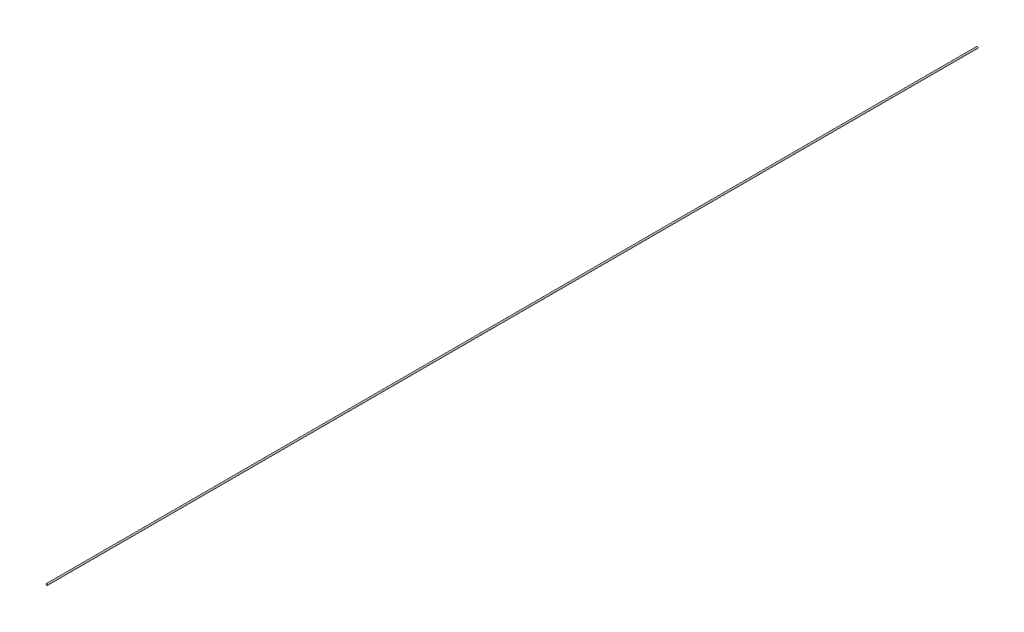
ISO-10303-21;
HEADER;
FILE_DESCRIPTION(('STEP AP214'),'2;1');
FILE_NAME('part.step','',(''),(''),'','','');
FILE_SCHEMA(('AUTOMOTIVE_DESIGN { 1 0 10303 214 1 1 1 1 }'));
ENDSEC;
DATA;
#1=APPLICATION_CONTEXT('core data for automotive mechanical design processes');
#2=APPLICATION_PROTOCOL_DEFINITION('international standard','automotive_design',2000,#1);
#3=PRODUCT_CONTEXT('',#1,'mechanical');
#4=PRODUCT('Part','Part','',(#3));
#5=PRODUCT_RELATED_PRODUCT_CATEGORY('part','',(#4));
#6=PRODUCT_DEFINITION_FORMATION('','',#4);
#7=PRODUCT_DEFINITION_CONTEXT('part definition',#1,'design');
#8=PRODUCT_DEFINITION('design','',#6,#7);
#9=PRODUCT_DEFINITION_SHAPE('','',#8);
#10=(LENGTH_UNIT() NAMED_UNIT(*) SI_UNIT(.MILLI.,.METRE.));
#11=(NAMED_UNIT(*) PLANE_ANGLE_UNIT() SI_UNIT($,.RADIAN.));
#12=(NAMED_UNIT(*) SI_UNIT($,.STERADIAN.) SOLID_ANGLE_UNIT());
#13=UNCERTAINTY_MEASURE_WITH_UNIT(LENGTH_MEASURE(1.E-05),#10,'distance_accuracy_value','');
#14=(GEOMETRIC_REPRESENTATION_CONTEXT(3) GLOBAL_UNCERTAINTY_ASSIGNED_CONTEXT((#13)) GLOBAL_UNIT_ASSIGNED_CONTEXT((#10,
#11,#12)) REPRESENTATION_CONTEXT('',''));
#15=CARTESIAN_POINT('',(0.,0.,0.));
#16=DIRECTION('',(0.,0.,1.));
#17=DIRECTION('',(1.,0.,0.));
#18=AXIS2_PLACEMENT_3D('',#15,#16,#17);
#19=CARTESIAN_POINT('',(0.,0.,233.5));
#20=DIRECTION('',(0.,0.,-1.));
#21=DIRECTION('',(-1.,0.,0.));
#22=AXIS2_PLACEMENT_3D('',#19,#20,#21);
#23=CYLINDRICAL_SURFACE('',#22,0.2);
#24=CARTESIAN_POINT('',(0.,0.,233.5));
#25=DIRECTION('',(0.,0.,1.));
#26=DIRECTION('',(1.,0.,0.));
#27=AXIS2_PLACEMENT_3D('',#24,#25,#26);
#28=CIRCLE('',#27,0.2);
#29=CARTESIAN_POINT('',(0.2,0.,233.5));
#30=VERTEX_POINT('',#29);
#31=EDGE_CURVE('E10',#30,#30,#28,.T.);
#32=ORIENTED_EDGE('',*,*,#31,.F.);
#33=EDGE_LOOP('',(#32));
#34=FACE_BOUND('',#33,.T.);
#35=CARTESIAN_POINT('',(0.,0.,0.));
#36=DIRECTION('',(0.,0.,1.));
#37=DIRECTION('',(1.,0.,0.));
#38=AXIS2_PLACEMENT_3D('',#35,#36,#37);
#39=CIRCLE('',#38,0.2);
#40=CARTESIAN_POINT('',(0.2,0.,0.));
#41=VERTEX_POINT('',#40);
#42=EDGE_CURVE('E36',#41,#41,#39,.T.);
#43=ORIENTED_EDGE('',*,*,#42,.T.);
#44=EDGE_LOOP('',(#43));
#45=FACE_BOUND('',#44,.T.);
#46=ADVANCED_FACE('F33',(#34,#45),#23,.T.);
#47=CARTESIAN_POINT('',(0.,0.,233.5));
#48=DIRECTION('',(0.,0.,1.));
#49=DIRECTION('',(1.,0.,0.));
#50=AXIS2_PLACEMENT_3D('',#47,#48,#49);
#51=PLANE('',#50);
#52=ORIENTED_EDGE('',*,*,#31,.T.);
#53=EDGE_LOOP('',(#52));
#54=FACE_BOUND('',#53,.T.);
#55=ADVANCED_FACE('F48',(#54),#51,.T.);
#56=CARTESIAN_POINT('',(0.,0.,0.));
#57=DIRECTION('',(0.,0.,1.));
#58=DIRECTION('',(1.,0.,0.));
#59=AXIS2_PLACEMENT_3D('',#56,#57,#58);
#60=PLANE('',#59);
#61=ORIENTED_EDGE('',*,*,#42,.F.);
#62=EDGE_LOOP('',(#61));
#63=FACE_BOUND('',#62,.T.);
#64=ADVANCED_FACE('F46',(#63),#60,.F.);
#65=CLOSED_SHELL('',(#46,#55,#64));
#66=MANIFOLD_SOLID_BREP('B2',#65);
#67=ADVANCED_BREP_SHAPE_REPRESENTATION('',(#18,#66),#14);
#68=SHAPE_DEFINITION_REPRESENTATION(#9,#67);
ENDSEC;
END-ISO-10303-21;
